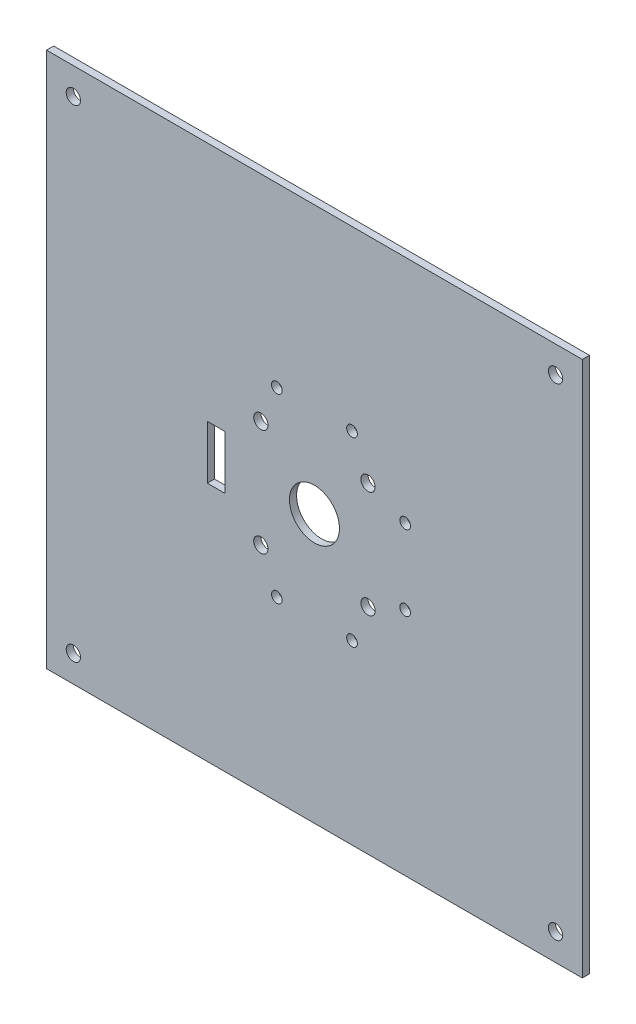
ISO-10303-21;
HEADER;
FILE_DESCRIPTION(('STEP AP214'),'2;1');
FILE_NAME('part.step','',(''),(''),'','','');
FILE_SCHEMA(('AUTOMOTIVE_DESIGN { 1 0 10303 214 1 1 1 1 }'));
ENDSEC;
DATA;
#1=APPLICATION_CONTEXT('core data for automotive mechanical design processes');
#2=APPLICATION_PROTOCOL_DEFINITION('international standard','automotive_design',2000,#1);
#3=PRODUCT_CONTEXT('',#1,'mechanical');
#4=PRODUCT('Part','Part','',(#3));
#5=PRODUCT_RELATED_PRODUCT_CATEGORY('part','',(#4));
#6=PRODUCT_DEFINITION_FORMATION('','',#4);
#7=PRODUCT_DEFINITION_CONTEXT('part definition',#1,'design');
#8=PRODUCT_DEFINITION('design','',#6,#7);
#9=PRODUCT_DEFINITION_SHAPE('','',#8);
#10=(LENGTH_UNIT() NAMED_UNIT(*) SI_UNIT(.MILLI.,.METRE.));
#11=(NAMED_UNIT(*) PLANE_ANGLE_UNIT() SI_UNIT($,.RADIAN.));
#12=(NAMED_UNIT(*) SI_UNIT($,.STERADIAN.) SOLID_ANGLE_UNIT());
#13=UNCERTAINTY_MEASURE_WITH_UNIT(LENGTH_MEASURE(1.E-05),#10,'distance_accuracy_value','');
#14=(GEOMETRIC_REPRESENTATION_CONTEXT(3) GLOBAL_UNCERTAINTY_ASSIGNED_CONTEXT((#13)) GLOBAL_UNIT_ASSIGNED_CONTEXT((#10,
#11,#12)) REPRESENTATION_CONTEXT('',''));
#15=CARTESIAN_POINT('',(0.,0.,0.));
#16=DIRECTION('',(0.,0.,1.));
#17=DIRECTION('',(1.,0.,0.));
#18=AXIS2_PLACEMENT_3D('',#15,#16,#17);
#19=CARTESIAN_POINT('',(75.,-75.,2.));
#20=DIRECTION('',(-1.,0.,0.));
#21=DIRECTION('',(0.,0.,1.));
#22=AXIS2_PLACEMENT_3D('',#19,#20,#21);
#23=PLANE('',#22);
#24=DIRECTION('',(0.,1.,0.));
#25=VECTOR('',#24,1.);
#26=CARTESIAN_POINT('',(75.,-75.,0.));
#27=LINE('',#26,#25);
#28=CARTESIAN_POINT('',(75.,-75.,0.));
#29=VERTEX_POINT('',#28);
#30=CARTESIAN_POINT('',(75.,75.,0.));
#31=VERTEX_POINT('',#30);
#32=EDGE_CURVE('E132',#29,#31,#27,.T.);
#33=ORIENTED_EDGE('',*,*,#32,.T.);
#34=DIRECTION('',(0.,0.,-1.));
#35=VECTOR('',#34,1.);
#36=CARTESIAN_POINT('',(75.,75.,2.));
#37=LINE('',#36,#35);
#38=CARTESIAN_POINT('',(75.,75.,2.));
#39=VERTEX_POINT('',#38);
#40=EDGE_CURVE('E11',#39,#31,#37,.T.);
#41=ORIENTED_EDGE('',*,*,#40,.F.);
#42=DIRECTION('',(0.,1.,0.));
#43=VECTOR('',#42,1.);
#44=CARTESIAN_POINT('',(75.,-75.,2.));
#45=LINE('',#44,#43);
#46=CARTESIAN_POINT('',(75.,-75.,2.));
#47=VERTEX_POINT('',#46);
#48=EDGE_CURVE('E136',#47,#39,#45,.T.);
#49=ORIENTED_EDGE('',*,*,#48,.F.);
#50=DIRECTION('',(0.,0.,-1.));
#51=VECTOR('',#50,1.);
#52=CARTESIAN_POINT('',(75.,-75.,2.));
#53=LINE('',#52,#51);
#54=EDGE_CURVE('E146',#47,#29,#53,.T.);
#55=ORIENTED_EDGE('',*,*,#54,.T.);
#56=EDGE_LOOP('',(#33,#41,#49,#55));
#57=FACE_BOUND('',#56,.T.);
#58=ADVANCED_FACE('F33',(#57),#23,.F.);
#59=CARTESIAN_POINT('',(-75.,75.,2.));
#60=DIRECTION('',(0.,-1.,0.));
#61=DIRECTION('',(0.,0.,-1.));
#62=AXIS2_PLACEMENT_3D('',#59,#60,#61);
#63=PLANE('',#62);
#64=DIRECTION('',(-1.,0.,0.));
#65=VECTOR('',#64,1.);
#66=CARTESIAN_POINT('',(-75.,75.,0.));
#67=LINE('',#66,#65);
#68=CARTESIAN_POINT('',(-75.,75.,0.));
#69=VERTEX_POINT('',#68);
#70=EDGE_CURVE('E149',#31,#69,#67,.T.);
#71=ORIENTED_EDGE('',*,*,#70,.T.);
#72=DIRECTION('',(0.,0.,-1.));
#73=VECTOR('',#72,1.);
#74=CARTESIAN_POINT('',(-75.,75.,2.));
#75=LINE('',#74,#73);
#76=CARTESIAN_POINT('',(-75.,75.,2.));
#77=VERTEX_POINT('',#76);
#78=EDGE_CURVE('E40',#77,#69,#75,.T.);
#79=ORIENTED_EDGE('',*,*,#78,.F.);
#80=DIRECTION('',(-1.,0.,0.));
#81=VECTOR('',#80,1.);
#82=CARTESIAN_POINT('',(-75.,75.,2.));
#83=LINE('',#82,#81);
#84=EDGE_CURVE('E139',#39,#77,#83,.T.);
#85=ORIENTED_EDGE('',*,*,#84,.F.);
#86=ORIENTED_EDGE('',*,*,#40,.T.);
#87=EDGE_LOOP('',(#71,#79,#85,#86));
#88=FACE_BOUND('',#87,.T.);
#89=ADVANCED_FACE('F177',(#88),#63,.F.);
#90=CARTESIAN_POINT('',(-75.,-75.,2.));
#91=DIRECTION('',(1.,0.,0.));
#92=DIRECTION('',(0.,0.,-1.));
#93=AXIS2_PLACEMENT_3D('',#90,#91,#92);
#94=PLANE('',#93);
#95=DIRECTION('',(0.,-1.,0.));
#96=VECTOR('',#95,1.);
#97=CARTESIAN_POINT('',(-75.,-75.,0.));
#98=LINE('',#97,#96);
#99=CARTESIAN_POINT('',(-75.,-75.,0.));
#100=VERTEX_POINT('',#99);
#101=EDGE_CURVE('E151',#69,#100,#98,.T.);
#102=ORIENTED_EDGE('',*,*,#101,.T.);
#103=DIRECTION('',(0.,0.,-1.));
#104=VECTOR('',#103,1.);
#105=CARTESIAN_POINT('',(-75.,-75.,2.));
#106=LINE('',#105,#104);
#107=CARTESIAN_POINT('',(-75.,-75.,2.));
#108=VERTEX_POINT('',#107);
#109=EDGE_CURVE('E156',#108,#100,#106,.T.);
#110=ORIENTED_EDGE('',*,*,#109,.F.);
#111=DIRECTION('',(0.,-1.,0.));
#112=VECTOR('',#111,1.);
#113=CARTESIAN_POINT('',(-75.,-75.,2.));
#114=LINE('',#113,#112);
#115=EDGE_CURVE('E142',#77,#108,#114,.T.);
#116=ORIENTED_EDGE('',*,*,#115,.F.);
#117=ORIENTED_EDGE('',*,*,#78,.T.);
#118=EDGE_LOOP('',(#102,#110,#116,#117));
#119=FACE_BOUND('',#118,.T.);
#120=ADVANCED_FACE('F163',(#119),#94,.F.);
#121=CARTESIAN_POINT('',(-75.,-75.,2.));
#122=DIRECTION('',(0.,1.,0.));
#123=DIRECTION('',(-1.,0.,0.));
#124=AXIS2_PLACEMENT_3D('',#121,#122,#123);
#125=PLANE('',#124);
#126=DIRECTION('',(1.,0.,0.));
#127=VECTOR('',#126,1.);
#128=CARTESIAN_POINT('',(-75.,-75.,0.));
#129=LINE('',#128,#127);
#130=EDGE_CURVE('E140',#100,#29,#129,.T.);
#131=ORIENTED_EDGE('',*,*,#130,.T.);
#132=ORIENTED_EDGE('',*,*,#54,.F.);
#133=DIRECTION('',(1.,0.,0.));
#134=VECTOR('',#133,1.);
#135=CARTESIAN_POINT('',(-75.,-75.,2.));
#136=LINE('',#135,#134);
#137=EDGE_CURVE('E144',#108,#47,#136,.T.);
#138=ORIENTED_EDGE('',*,*,#137,.F.);
#139=ORIENTED_EDGE('',*,*,#109,.T.);
#140=EDGE_LOOP('',(#131,#132,#138,#139));
#141=FACE_BOUND('',#140,.T.);
#142=ADVANCED_FACE('F170',(#141),#125,.F.);
#143=CARTESIAN_POINT('',(0.,0.,2.));
#144=DIRECTION('',(0.,0.,-1.));
#145=DIRECTION('',(-1.,0.,0.));
#146=AXIS2_PLACEMENT_3D('',#143,#144,#145);
#147=PLANE('',#146);
#148=CARTESIAN_POINT('',(67.4999999999995,67.5,2.));
#149=DIRECTION('',(0.,0.,1.));
#150=DIRECTION('',(1.,0.,0.));
#151=AXIS2_PLACEMENT_3D('',#148,#149,#150);
#152=CIRCLE('',#151,2.00000000000001);
#153=CARTESIAN_POINT('',(69.4999999999995,67.5,2.));
#154=VERTEX_POINT('',#153);
#155=EDGE_CURVE('E272',#154,#154,#152,.T.);
#156=ORIENTED_EDGE('',*,*,#155,.F.);
#157=EDGE_LOOP('',(#156));
#158=FACE_BOUND('',#157,.T.);
#159=CARTESIAN_POINT('',(-67.5000000000005,67.5,2.));
#160=DIRECTION('',(0.,0.,1.));
#161=DIRECTION('',(1.,0.,0.));
#162=AXIS2_PLACEMENT_3D('',#159,#160,#161);
#163=CIRCLE('',#162,2.00000000000001);
#164=CARTESIAN_POINT('',(-65.5000000000005,67.5,2.));
#165=VERTEX_POINT('',#164);
#166=EDGE_CURVE('E276',#165,#165,#163,.T.);
#167=ORIENTED_EDGE('',*,*,#166,.F.);
#168=EDGE_LOOP('',(#167));
#169=FACE_BOUND('',#168,.T.);
#170=CARTESIAN_POINT('',(-67.5,-67.5,2.));
#171=DIRECTION('',(0.,0.,1.));
#172=DIRECTION('',(1.,0.,0.));
#173=AXIS2_PLACEMENT_3D('',#170,#171,#172);
#174=CIRCLE('',#173,2.00000000000001);
#175=CARTESIAN_POINT('',(-65.5,-67.5,2.));
#176=VERTEX_POINT('',#175);
#177=EDGE_CURVE('E283',#176,#176,#174,.T.);
#178=ORIENTED_EDGE('',*,*,#177,.F.);
#179=EDGE_LOOP('',(#178));
#180=FACE_BOUND('',#179,.T.);
#181=CARTESIAN_POINT('',(67.5,-67.5,2.));
#182=DIRECTION('',(0.,0.,1.));
#183=DIRECTION('',(1.,0.,0.));
#184=AXIS2_PLACEMENT_3D('',#181,#182,#183);
#185=CIRCLE('',#184,2.00000000000001);
#186=CARTESIAN_POINT('',(69.5,-67.5,2.));
#187=VERTEX_POINT('',#186);
#188=EDGE_CURVE('E289',#187,#187,#185,.T.);
#189=ORIENTED_EDGE('',*,*,#188,.F.);
#190=EDGE_LOOP('',(#189));
#191=FACE_BOUND('',#190,.T.);
#192=CARTESIAN_POINT('',(-10.5237943900402,-25.4066871440603,2.));
#193=DIRECTION('',(0.,0.,1.));
#194=DIRECTION('',(1.,0.,0.));
#195=AXIS2_PLACEMENT_3D('',#192,#193,#194);
#196=CIRCLE('',#195,1.5);
#197=CARTESIAN_POINT('',(-9.02379439004023,-25.4066871440603,2.));
#198=VERTEX_POINT('',#197);
#199=EDGE_CURVE('E295',#198,#198,#196,.T.);
#200=ORIENTED_EDGE('',*,*,#199,.F.);
#201=EDGE_LOOP('',(#200));
#202=FACE_BOUND('',#201,.T.);
#203=CARTESIAN_POINT('',(10.5237943900397,-25.4066871440605,2.));
#204=DIRECTION('',(0.,0.,1.));
#205=DIRECTION('',(1.,0.,0.));
#206=AXIS2_PLACEMENT_3D('',#203,#204,#205);
#207=CIRCLE('',#206,1.5);
#208=CARTESIAN_POINT('',(12.0237943900397,-25.4066871440605,2.));
#209=VERTEX_POINT('',#208);
#210=EDGE_CURVE('E301',#209,#209,#207,.T.);
#211=ORIENTED_EDGE('',*,*,#210,.F.);
#212=EDGE_LOOP('',(#211));
#213=FACE_BOUND('',#212,.T.);
#214=CARTESIAN_POINT('',(25.4066871440603,-10.5237943900402,2.));
#215=DIRECTION('',(0.,0.,1.));
#216=DIRECTION('',(1.,0.,0.));
#217=AXIS2_PLACEMENT_3D('',#214,#215,#216);
#218=CIRCLE('',#217,1.5);
#219=CARTESIAN_POINT('',(26.9066871440603,-10.5237943900402,2.));
#220=VERTEX_POINT('',#219);
#221=EDGE_CURVE('E307',#220,#220,#218,.T.);
#222=ORIENTED_EDGE('',*,*,#221,.F.);
#223=EDGE_LOOP('',(#222));
#224=FACE_BOUND('',#223,.T.);
#225=CARTESIAN_POINT('',(-10.5237943900399,25.4066871440604,2.));
#226=DIRECTION('',(0.,0.,1.));
#227=DIRECTION('',(1.,0.,0.));
#228=AXIS2_PLACEMENT_3D('',#225,#226,#227);
#229=CIRCLE('',#228,1.5);
#230=CARTESIAN_POINT('',(-9.02379439003992,25.4066871440604,2.));
#231=VERTEX_POINT('',#230);
#232=EDGE_CURVE('E313',#231,#231,#229,.T.);
#233=ORIENTED_EDGE('',*,*,#232,.F.);
#234=EDGE_LOOP('',(#233));
#235=FACE_BOUND('',#234,.T.);
#236=CARTESIAN_POINT('',(10.5237943900401,25.4066871440604,2.));
#237=DIRECTION('',(0.,0.,1.));
#238=DIRECTION('',(1.,0.,0.));
#239=AXIS2_PLACEMENT_3D('',#236,#237,#238);
#240=CIRCLE('',#239,1.5);
#241=CARTESIAN_POINT('',(12.0237943900401,25.4066871440604,2.));
#242=VERTEX_POINT('',#241);
#243=EDGE_CURVE('E319',#242,#242,#240,.T.);
#244=ORIENTED_EDGE('',*,*,#243,.F.);
#245=EDGE_LOOP('',(#244));
#246=FACE_BOUND('',#245,.T.);
#247=CARTESIAN_POINT('',(25.4066871440604,10.5237943900398,2.));
#248=DIRECTION('',(0.,0.,1.));
#249=DIRECTION('',(1.,0.,0.));
#250=AXIS2_PLACEMENT_3D('',#247,#248,#249);
#251=CIRCLE('',#250,1.5);
#252=CARTESIAN_POINT('',(26.9066871440604,10.5237943900398,2.));
#253=VERTEX_POINT('',#252);
#254=EDGE_CURVE('E325',#253,#253,#251,.T.);
#255=ORIENTED_EDGE('',*,*,#254,.F.);
#256=EDGE_LOOP('',(#255));
#257=FACE_BOUND('',#256,.T.);
#258=CARTESIAN_POINT('',(-15.,-15.,2.));
#259=DIRECTION('',(0.,0.,1.));
#260=DIRECTION('',(1.,0.,0.));
#261=AXIS2_PLACEMENT_3D('',#258,#259,#260);
#262=CIRCLE('',#261,2.);
#263=CARTESIAN_POINT('',(-13.,-15.,2.));
#264=VERTEX_POINT('',#263);
#265=EDGE_CURVE('E331',#264,#264,#262,.T.);
#266=ORIENTED_EDGE('',*,*,#265,.F.);
#267=EDGE_LOOP('',(#266));
#268=FACE_BOUND('',#267,.T.);
#269=CARTESIAN_POINT('',(15.,-15.,2.));
#270=DIRECTION('',(0.,0.,1.));
#271=DIRECTION('',(1.,0.,0.));
#272=AXIS2_PLACEMENT_3D('',#269,#270,#271);
#273=CIRCLE('',#272,2.);
#274=CARTESIAN_POINT('',(17.,-15.,2.));
#275=VERTEX_POINT('',#274);
#276=EDGE_CURVE('E337',#275,#275,#273,.T.);
#277=ORIENTED_EDGE('',*,*,#276,.F.);
#278=EDGE_LOOP('',(#277));
#279=FACE_BOUND('',#278,.T.);
#280=CARTESIAN_POINT('',(-15.0000000000001,15.,2.));
#281=DIRECTION('',(0.,0.,1.));
#282=DIRECTION('',(1.,0.,0.));
#283=AXIS2_PLACEMENT_3D('',#280,#281,#282);
#284=CIRCLE('',#283,2.);
#285=CARTESIAN_POINT('',(-13.0000000000001,15.,2.));
#286=VERTEX_POINT('',#285);
#287=EDGE_CURVE('E343',#286,#286,#284,.T.);
#288=ORIENTED_EDGE('',*,*,#287,.F.);
#289=EDGE_LOOP('',(#288));
#290=FACE_BOUND('',#289,.T.);
#291=CARTESIAN_POINT('',(14.9999999999999,15.,2.));
#292=DIRECTION('',(0.,0.,1.));
#293=DIRECTION('',(1.,0.,0.));
#294=AXIS2_PLACEMENT_3D('',#291,#292,#293);
#295=CIRCLE('',#294,2.);
#296=CARTESIAN_POINT('',(16.9999999999999,15.,2.));
#297=VERTEX_POINT('',#296);
#298=EDGE_CURVE('E349',#297,#297,#295,.T.);
#299=ORIENTED_EDGE('',*,*,#298,.F.);
#300=EDGE_LOOP('',(#299));
#301=FACE_BOUND('',#300,.T.);
#302=CARTESIAN_POINT('',(0.,0.,2.));
#303=DIRECTION('',(0.,0.,1.));
#304=DIRECTION('',(1.,0.,0.));
#305=AXIS2_PLACEMENT_3D('',#302,#303,#304);
#306=CIRCLE('',#305,7.);
#307=CARTESIAN_POINT('',(7.,0.,2.));
#308=VERTEX_POINT('',#307);
#309=EDGE_CURVE('E126',#308,#308,#306,.T.);
#310=ORIENTED_EDGE('',*,*,#309,.F.);
#311=EDGE_LOOP('',(#310));
#312=FACE_BOUND('',#311,.T.);
#313=DIRECTION('',(0.,1.,0.));
#314=VECTOR('',#313,1.);
#315=CARTESIAN_POINT('',(-25.,-7.50000000000001,2.));
#316=LINE('',#315,#314);
#317=CARTESIAN_POINT('',(-25.,-7.50000000000001,2.));
#318=VERTEX_POINT('',#317);
#319=CARTESIAN_POINT('',(-25.,7.49999999999999,2.));
#320=VERTEX_POINT('',#319);
#321=EDGE_CURVE('E125',#318,#320,#316,.T.);
#322=ORIENTED_EDGE('',*,*,#321,.F.);
#323=DIRECTION('',(1.,0.,0.));
#324=VECTOR('',#323,1.);
#325=CARTESIAN_POINT('',(-30.,-7.50000000000001,2.));
#326=LINE('',#325,#324);
#327=CARTESIAN_POINT('',(-30.,-7.50000000000001,2.));
#328=VERTEX_POINT('',#327);
#329=EDGE_CURVE('E47',#328,#318,#326,.T.);
#330=ORIENTED_EDGE('',*,*,#329,.F.);
#331=DIRECTION('',(0.,1.,0.));
#332=VECTOR('',#331,1.);
#333=CARTESIAN_POINT('',(-30.,-7.50000000000001,2.));
#334=LINE('',#333,#332);
#335=CARTESIAN_POINT('',(-30.,7.49999999999998,2.));
#336=VERTEX_POINT('',#335);
#337=EDGE_CURVE('E113',#328,#336,#334,.T.);
#338=ORIENTED_EDGE('',*,*,#337,.T.);
#339=DIRECTION('',(1.,0.,0.));
#340=VECTOR('',#339,1.);
#341=CARTESIAN_POINT('',(-30.,7.49999999999998,2.));
#342=LINE('',#341,#340);
#343=EDGE_CURVE('E116',#336,#320,#342,.T.);
#344=ORIENTED_EDGE('',*,*,#343,.T.);
#345=EDGE_LOOP('',(#322,#330,#338,#344));
#346=FACE_BOUND('',#345,.T.);
#347=ORIENTED_EDGE('',*,*,#48,.T.);
#348=ORIENTED_EDGE('',*,*,#84,.T.);
#349=ORIENTED_EDGE('',*,*,#115,.T.);
#350=ORIENTED_EDGE('',*,*,#137,.T.);
#351=EDGE_LOOP('',(#347,#348,#349,#350));
#352=FACE_BOUND('',#351,.T.);
#353=ADVANCED_FACE('F176',(#158,#169,#180,#191,#202,#213,#224,#235,#246,#257,#268,#279,#290,
#301,#312,#346,#352),#147,.F.);
#354=CARTESIAN_POINT('',(0.,0.,0.));
#355=DIRECTION('',(0.,0.,-1.));
#356=DIRECTION('',(-1.,0.,0.));
#357=AXIS2_PLACEMENT_3D('',#354,#355,#356);
#358=PLANE('',#357);
#359=CARTESIAN_POINT('',(67.4999999999995,67.5,0.));
#360=DIRECTION('',(0.,0.,1.));
#361=DIRECTION('',(1.,0.,0.));
#362=AXIS2_PLACEMENT_3D('',#359,#360,#361);
#363=CIRCLE('',#362,2.00000000000001);
#364=CARTESIAN_POINT('',(69.4999999999995,67.5,0.));
#365=VERTEX_POINT('',#364);
#366=EDGE_CURVE('E269',#365,#365,#363,.T.);
#367=ORIENTED_EDGE('',*,*,#366,.T.);
#368=EDGE_LOOP('',(#367));
#369=FACE_BOUND('',#368,.T.);
#370=CARTESIAN_POINT('',(-67.5000000000005,67.5,0.));
#371=DIRECTION('',(0.,0.,1.));
#372=DIRECTION('',(1.,0.,0.));
#373=AXIS2_PLACEMENT_3D('',#370,#371,#372);
#374=CIRCLE('',#373,2.00000000000001);
#375=CARTESIAN_POINT('',(-65.5000000000005,67.5,0.));
#376=VERTEX_POINT('',#375);
#377=EDGE_CURVE('E273',#376,#376,#374,.T.);
#378=ORIENTED_EDGE('',*,*,#377,.T.);
#379=EDGE_LOOP('',(#378));
#380=FACE_BOUND('',#379,.T.);
#381=CARTESIAN_POINT('',(-67.5,-67.5,0.));
#382=DIRECTION('',(0.,0.,1.));
#383=DIRECTION('',(1.,0.,0.));
#384=AXIS2_PLACEMENT_3D('',#381,#382,#383);
#385=CIRCLE('',#384,2.00000000000001);
#386=CARTESIAN_POINT('',(-65.5,-67.5,0.));
#387=VERTEX_POINT('',#386);
#388=EDGE_CURVE('E281',#387,#387,#385,.T.);
#389=ORIENTED_EDGE('',*,*,#388,.T.);
#390=EDGE_LOOP('',(#389));
#391=FACE_BOUND('',#390,.T.);
#392=CARTESIAN_POINT('',(67.5,-67.5,0.));
#393=DIRECTION('',(0.,0.,1.));
#394=DIRECTION('',(1.,0.,0.));
#395=AXIS2_PLACEMENT_3D('',#392,#393,#394);
#396=CIRCLE('',#395,2.00000000000001);
#397=CARTESIAN_POINT('',(69.5,-67.5,0.));
#398=VERTEX_POINT('',#397);
#399=EDGE_CURVE('E286',#398,#398,#396,.T.);
#400=ORIENTED_EDGE('',*,*,#399,.T.);
#401=EDGE_LOOP('',(#400));
#402=FACE_BOUND('',#401,.T.);
#403=CARTESIAN_POINT('',(-10.5237943900402,-25.4066871440603,0.));
#404=DIRECTION('',(0.,0.,1.));
#405=DIRECTION('',(1.,0.,0.));
#406=AXIS2_PLACEMENT_3D('',#403,#404,#405);
#407=CIRCLE('',#406,1.5);
#408=CARTESIAN_POINT('',(-9.02379439004023,-25.4066871440603,0.));
#409=VERTEX_POINT('',#408);
#410=EDGE_CURVE('E292',#409,#409,#407,.T.);
#411=ORIENTED_EDGE('',*,*,#410,.T.);
#412=EDGE_LOOP('',(#411));
#413=FACE_BOUND('',#412,.T.);
#414=CARTESIAN_POINT('',(10.5237943900397,-25.4066871440605,0.));
#415=DIRECTION('',(0.,0.,1.));
#416=DIRECTION('',(1.,0.,0.));
#417=AXIS2_PLACEMENT_3D('',#414,#415,#416);
#418=CIRCLE('',#417,1.5);
#419=CARTESIAN_POINT('',(12.0237943900397,-25.4066871440605,0.));
#420=VERTEX_POINT('',#419);
#421=EDGE_CURVE('E298',#420,#420,#418,.T.);
#422=ORIENTED_EDGE('',*,*,#421,.T.);
#423=EDGE_LOOP('',(#422));
#424=FACE_BOUND('',#423,.T.);
#425=CARTESIAN_POINT('',(25.4066871440603,-10.5237943900402,0.));
#426=DIRECTION('',(0.,0.,1.));
#427=DIRECTION('',(1.,0.,0.));
#428=AXIS2_PLACEMENT_3D('',#425,#426,#427);
#429=CIRCLE('',#428,1.5);
#430=CARTESIAN_POINT('',(26.9066871440603,-10.5237943900402,0.));
#431=VERTEX_POINT('',#430);
#432=EDGE_CURVE('E304',#431,#431,#429,.T.);
#433=ORIENTED_EDGE('',*,*,#432,.T.);
#434=EDGE_LOOP('',(#433));
#435=FACE_BOUND('',#434,.T.);
#436=CARTESIAN_POINT('',(-10.5237943900399,25.4066871440604,0.));
#437=DIRECTION('',(0.,0.,1.));
#438=DIRECTION('',(1.,0.,0.));
#439=AXIS2_PLACEMENT_3D('',#436,#437,#438);
#440=CIRCLE('',#439,1.5);
#441=CARTESIAN_POINT('',(-9.02379439003992,25.4066871440604,0.));
#442=VERTEX_POINT('',#441);
#443=EDGE_CURVE('E310',#442,#442,#440,.T.);
#444=ORIENTED_EDGE('',*,*,#443,.T.);
#445=EDGE_LOOP('',(#444));
#446=FACE_BOUND('',#445,.T.);
#447=CARTESIAN_POINT('',(10.5237943900401,25.4066871440604,0.));
#448=DIRECTION('',(0.,0.,1.));
#449=DIRECTION('',(1.,0.,0.));
#450=AXIS2_PLACEMENT_3D('',#447,#448,#449);
#451=CIRCLE('',#450,1.5);
#452=CARTESIAN_POINT('',(12.0237943900401,25.4066871440604,0.));
#453=VERTEX_POINT('',#452);
#454=EDGE_CURVE('E316',#453,#453,#451,.T.);
#455=ORIENTED_EDGE('',*,*,#454,.T.);
#456=EDGE_LOOP('',(#455));
#457=FACE_BOUND('',#456,.T.);
#458=CARTESIAN_POINT('',(25.4066871440604,10.5237943900398,0.));
#459=DIRECTION('',(0.,0.,1.));
#460=DIRECTION('',(1.,0.,0.));
#461=AXIS2_PLACEMENT_3D('',#458,#459,#460);
#462=CIRCLE('',#461,1.5);
#463=CARTESIAN_POINT('',(26.9066871440604,10.5237943900398,0.));
#464=VERTEX_POINT('',#463);
#465=EDGE_CURVE('E322',#464,#464,#462,.T.);
#466=ORIENTED_EDGE('',*,*,#465,.T.);
#467=EDGE_LOOP('',(#466));
#468=FACE_BOUND('',#467,.T.);
#469=CARTESIAN_POINT('',(-15.,-15.,0.));
#470=DIRECTION('',(0.,0.,1.));
#471=DIRECTION('',(1.,0.,0.));
#472=AXIS2_PLACEMENT_3D('',#469,#470,#471);
#473=CIRCLE('',#472,2.);
#474=CARTESIAN_POINT('',(-13.,-15.,0.));
#475=VERTEX_POINT('',#474);
#476=EDGE_CURVE('E328',#475,#475,#473,.T.);
#477=ORIENTED_EDGE('',*,*,#476,.T.);
#478=EDGE_LOOP('',(#477));
#479=FACE_BOUND('',#478,.T.);
#480=CARTESIAN_POINT('',(15.,-15.,0.));
#481=DIRECTION('',(0.,0.,1.));
#482=DIRECTION('',(1.,0.,0.));
#483=AXIS2_PLACEMENT_3D('',#480,#481,#482);
#484=CIRCLE('',#483,2.);
#485=CARTESIAN_POINT('',(17.,-15.,0.));
#486=VERTEX_POINT('',#485);
#487=EDGE_CURVE('E334',#486,#486,#484,.T.);
#488=ORIENTED_EDGE('',*,*,#487,.T.);
#489=EDGE_LOOP('',(#488));
#490=FACE_BOUND('',#489,.T.);
#491=CARTESIAN_POINT('',(-15.0000000000001,15.,0.));
#492=DIRECTION('',(0.,0.,1.));
#493=DIRECTION('',(1.,0.,0.));
#494=AXIS2_PLACEMENT_3D('',#491,#492,#493);
#495=CIRCLE('',#494,2.);
#496=CARTESIAN_POINT('',(-13.0000000000001,15.,0.));
#497=VERTEX_POINT('',#496);
#498=EDGE_CURVE('E340',#497,#497,#495,.T.);
#499=ORIENTED_EDGE('',*,*,#498,.T.);
#500=EDGE_LOOP('',(#499));
#501=FACE_BOUND('',#500,.T.);
#502=CARTESIAN_POINT('',(14.9999999999999,15.,0.));
#503=DIRECTION('',(0.,0.,1.));
#504=DIRECTION('',(1.,0.,0.));
#505=AXIS2_PLACEMENT_3D('',#502,#503,#504);
#506=CIRCLE('',#505,2.);
#507=CARTESIAN_POINT('',(16.9999999999999,15.,0.));
#508=VERTEX_POINT('',#507);
#509=EDGE_CURVE('E346',#508,#508,#506,.T.);
#510=ORIENTED_EDGE('',*,*,#509,.T.);
#511=EDGE_LOOP('',(#510));
#512=FACE_BOUND('',#511,.T.);
#513=CARTESIAN_POINT('',(0.,0.,0.));
#514=DIRECTION('',(0.,0.,1.));
#515=DIRECTION('',(1.,0.,0.));
#516=AXIS2_PLACEMENT_3D('',#513,#514,#515);
#517=CIRCLE('',#516,7.);
#518=CARTESIAN_POINT('',(7.,0.,0.));
#519=VERTEX_POINT('',#518);
#520=EDGE_CURVE('E119',#519,#519,#517,.T.);
#521=ORIENTED_EDGE('',*,*,#520,.T.);
#522=EDGE_LOOP('',(#521));
#523=FACE_BOUND('',#522,.T.);
#524=DIRECTION('',(1.,0.,0.));
#525=VECTOR('',#524,1.);
#526=CARTESIAN_POINT('',(-30.,-7.50000000000001,0.));
#527=LINE('',#526,#525);
#528=CARTESIAN_POINT('',(-30.,-7.50000000000001,0.));
#529=VERTEX_POINT('',#528);
#530=CARTESIAN_POINT('',(-25.,-7.50000000000001,0.));
#531=VERTEX_POINT('',#530);
#532=EDGE_CURVE('E99',#529,#531,#527,.T.);
#533=ORIENTED_EDGE('',*,*,#532,.T.);
#534=DIRECTION('',(0.,1.,0.));
#535=VECTOR('',#534,1.);
#536=CARTESIAN_POINT('',(-25.,-7.50000000000001,0.));
#537=LINE('',#536,#535);
#538=CARTESIAN_POINT('',(-25.,7.49999999999999,0.));
#539=VERTEX_POINT('',#538);
#540=EDGE_CURVE('E105',#531,#539,#537,.T.);
#541=ORIENTED_EDGE('',*,*,#540,.T.);
#542=DIRECTION('',(1.,0.,0.));
#543=VECTOR('',#542,1.);
#544=CARTESIAN_POINT('',(-30.,7.49999999999998,0.));
#545=LINE('',#544,#543);
#546=CARTESIAN_POINT('',(-30.,7.49999999999998,0.));
#547=VERTEX_POINT('',#546);
#548=EDGE_CURVE('E109',#547,#539,#545,.T.);
#549=ORIENTED_EDGE('',*,*,#548,.F.);
#550=DIRECTION('',(0.,1.,0.));
#551=VECTOR('',#550,1.);
#552=CARTESIAN_POINT('',(-30.,-7.50000000000001,0.));
#553=LINE('',#552,#551);
#554=EDGE_CURVE('E102',#529,#547,#553,.T.);
#555=ORIENTED_EDGE('',*,*,#554,.F.);
#556=EDGE_LOOP('',(#533,#541,#549,#555));
#557=FACE_BOUND('',#556,.T.);
#558=ORIENTED_EDGE('',*,*,#32,.F.);
#559=ORIENTED_EDGE('',*,*,#130,.F.);
#560=ORIENTED_EDGE('',*,*,#101,.F.);
#561=ORIENTED_EDGE('',*,*,#70,.F.);
#562=EDGE_LOOP('',(#558,#559,#560,#561));
#563=FACE_BOUND('',#562,.T.);
#564=ADVANCED_FACE('F111',(#369,#380,#391,#402,#413,#424,#435,#446,#457,#468,#479,#490,#501,
#512,#523,#557,#563),#358,.T.);
#565=CARTESIAN_POINT('',(-30.,-7.50000000000001,0.));
#566=DIRECTION('',(0.,-1.,0.));
#567=DIRECTION('',(0.,0.,-1.));
#568=AXIS2_PLACEMENT_3D('',#565,#566,#567);
#569=PLANE('',#568);
#570=ORIENTED_EDGE('',*,*,#329,.T.);
#571=DIRECTION('',(0.,0.,1.));
#572=VECTOR('',#571,1.);
#573=CARTESIAN_POINT('',(-25.,-7.50000000000001,0.));
#574=LINE('',#573,#572);
#575=EDGE_CURVE('E96',#531,#318,#574,.T.);
#576=ORIENTED_EDGE('',*,*,#575,.F.);
#577=ORIENTED_EDGE('',*,*,#532,.F.);
#578=DIRECTION('',(0.,0.,1.));
#579=VECTOR('',#578,1.);
#580=CARTESIAN_POINT('',(-30.,-7.50000000000001,0.));
#581=LINE('',#580,#579);
#582=EDGE_CURVE('E130',#529,#328,#581,.T.);
#583=ORIENTED_EDGE('',*,*,#582,.T.);
#584=EDGE_LOOP('',(#570,#576,#577,#583));
#585=FACE_BOUND('',#584,.T.);
#586=ADVANCED_FACE('F97',(#585),#569,.F.);
#587=CARTESIAN_POINT('',(-30.,-7.50000000000001,0.));
#588=DIRECTION('',(1.,0.,0.));
#589=DIRECTION('',(0.,0.,-1.));
#590=AXIS2_PLACEMENT_3D('',#587,#588,#589);
#591=PLANE('',#590);
#592=ORIENTED_EDGE('',*,*,#337,.F.);
#593=ORIENTED_EDGE('',*,*,#582,.F.);
#594=ORIENTED_EDGE('',*,*,#554,.T.);
#595=DIRECTION('',(0.,0.,1.));
#596=VECTOR('',#595,1.);
#597=CARTESIAN_POINT('',(-30.,7.49999999999998,0.));
#598=LINE('',#597,#596);
#599=EDGE_CURVE('E133',#547,#336,#598,.T.);
#600=ORIENTED_EDGE('',*,*,#599,.T.);
#601=EDGE_LOOP('',(#592,#593,#594,#600));
#602=FACE_BOUND('',#601,.T.);
#603=ADVANCED_FACE('F195',(#602),#591,.T.);
#604=CARTESIAN_POINT('',(-30.,7.49999999999998,0.));
#605=DIRECTION('',(0.,-1.,0.));
#606=DIRECTION('',(1.,0.,0.));
#607=AXIS2_PLACEMENT_3D('',#604,#605,#606);
#608=PLANE('',#607);
#609=ORIENTED_EDGE('',*,*,#343,.F.);
#610=ORIENTED_EDGE('',*,*,#599,.F.);
#611=ORIENTED_EDGE('',*,*,#548,.T.);
#612=DIRECTION('',(0.,0.,1.));
#613=VECTOR('',#612,1.);
#614=CARTESIAN_POINT('',(-25.,7.49999999999999,0.));
#615=LINE('',#614,#613);
#616=EDGE_CURVE('E55',#539,#320,#615,.T.);
#617=ORIENTED_EDGE('',*,*,#616,.T.);
#618=EDGE_LOOP('',(#609,#610,#611,#617));
#619=FACE_BOUND('',#618,.T.);
#620=ADVANCED_FACE('F199',(#619),#608,.T.);
#621=CARTESIAN_POINT('',(-25.,-7.50000000000001,0.));
#622=DIRECTION('',(1.,0.,0.));
#623=DIRECTION('',(0.,0.,-1.));
#624=AXIS2_PLACEMENT_3D('',#621,#622,#623);
#625=PLANE('',#624);
#626=ORIENTED_EDGE('',*,*,#321,.T.);
#627=ORIENTED_EDGE('',*,*,#616,.F.);
#628=ORIENTED_EDGE('',*,*,#540,.F.);
#629=ORIENTED_EDGE('',*,*,#575,.T.);
#630=EDGE_LOOP('',(#626,#627,#628,#629));
#631=FACE_BOUND('',#630,.T.);
#632=ADVANCED_FACE('F106',(#631),#625,.F.);
#633=CARTESIAN_POINT('',(0.,0.,0.));
#634=DIRECTION('',(0.,0.,1.));
#635=DIRECTION('',(1.,0.,0.));
#636=AXIS2_PLACEMENT_3D('',#633,#634,#635);
#637=CYLINDRICAL_SURFACE('',#636,7.);
#638=ORIENTED_EDGE('',*,*,#520,.F.);
#639=EDGE_LOOP('',(#638));
#640=FACE_BOUND('',#639,.T.);
#641=ORIENTED_EDGE('',*,*,#309,.T.);
#642=EDGE_LOOP('',(#641));
#643=FACE_BOUND('',#642,.T.);
#644=ADVANCED_FACE('F198',(#640,#643),#637,.F.);
#645=CARTESIAN_POINT('',(14.9999999999999,15.,0.));
#646=DIRECTION('',(0.,0.,1.));
#647=DIRECTION('',(1.,0.,0.));
#648=AXIS2_PLACEMENT_3D('',#645,#646,#647);
#649=CYLINDRICAL_SURFACE('',#648,2.);
#650=ORIENTED_EDGE('',*,*,#509,.F.);
#651=EDGE_LOOP('',(#650));
#652=FACE_BOUND('',#651,.T.);
#653=ORIENTED_EDGE('',*,*,#298,.T.);
#654=EDGE_LOOP('',(#653));
#655=FACE_BOUND('',#654,.T.);
#656=ADVANCED_FACE('F208',(#652,#655),#649,.F.);
#657=CARTESIAN_POINT('',(-15.0000000000001,15.,0.));
#658=DIRECTION('',(0.,0.,1.));
#659=DIRECTION('',(1.,0.,0.));
#660=AXIS2_PLACEMENT_3D('',#657,#658,#659);
#661=CYLINDRICAL_SURFACE('',#660,2.);
#662=ORIENTED_EDGE('',*,*,#498,.F.);
#663=EDGE_LOOP('',(#662));
#664=FACE_BOUND('',#663,.T.);
#665=ORIENTED_EDGE('',*,*,#287,.T.);
#666=EDGE_LOOP('',(#665));
#667=FACE_BOUND('',#666,.T.);
#668=ADVANCED_FACE('F212',(#664,#667),#661,.F.);
#669=CARTESIAN_POINT('',(15.,-15.,0.));
#670=DIRECTION('',(0.,0.,1.));
#671=DIRECTION('',(1.,0.,0.));
#672=AXIS2_PLACEMENT_3D('',#669,#670,#671);
#673=CYLINDRICAL_SURFACE('',#672,2.);
#674=ORIENTED_EDGE('',*,*,#487,.F.);
#675=EDGE_LOOP('',(#674));
#676=FACE_BOUND('',#675,.T.);
#677=ORIENTED_EDGE('',*,*,#276,.T.);
#678=EDGE_LOOP('',(#677));
#679=FACE_BOUND('',#678,.T.);
#680=ADVANCED_FACE('F216',(#676,#679),#673,.F.);
#681=CARTESIAN_POINT('',(-15.,-15.,0.));
#682=DIRECTION('',(0.,0.,1.));
#683=DIRECTION('',(1.,0.,0.));
#684=AXIS2_PLACEMENT_3D('',#681,#682,#683);
#685=CYLINDRICAL_SURFACE('',#684,2.);
#686=ORIENTED_EDGE('',*,*,#476,.F.);
#687=EDGE_LOOP('',(#686));
#688=FACE_BOUND('',#687,.T.);
#689=ORIENTED_EDGE('',*,*,#265,.T.);
#690=EDGE_LOOP('',(#689));
#691=FACE_BOUND('',#690,.T.);
#692=ADVANCED_FACE('F220',(#688,#691),#685,.F.);
#693=CARTESIAN_POINT('',(25.4066871440604,10.5237943900398,0.));
#694=DIRECTION('',(0.,0.,1.));
#695=DIRECTION('',(1.,0.,0.));
#696=AXIS2_PLACEMENT_3D('',#693,#694,#695);
#697=CYLINDRICAL_SURFACE('',#696,1.5);
#698=ORIENTED_EDGE('',*,*,#465,.F.);
#699=EDGE_LOOP('',(#698));
#700=FACE_BOUND('',#699,.T.);
#701=ORIENTED_EDGE('',*,*,#254,.T.);
#702=EDGE_LOOP('',(#701));
#703=FACE_BOUND('',#702,.T.);
#704=ADVANCED_FACE('F224',(#700,#703),#697,.F.);
#705=CARTESIAN_POINT('',(10.5237943900401,25.4066871440604,0.));
#706=DIRECTION('',(0.,0.,1.));
#707=DIRECTION('',(1.,0.,0.));
#708=AXIS2_PLACEMENT_3D('',#705,#706,#707);
#709=CYLINDRICAL_SURFACE('',#708,1.5);
#710=ORIENTED_EDGE('',*,*,#454,.F.);
#711=EDGE_LOOP('',(#710));
#712=FACE_BOUND('',#711,.T.);
#713=ORIENTED_EDGE('',*,*,#243,.T.);
#714=EDGE_LOOP('',(#713));
#715=FACE_BOUND('',#714,.T.);
#716=ADVANCED_FACE('F228',(#712,#715),#709,.F.);
#717=CARTESIAN_POINT('',(-10.5237943900399,25.4066871440604,0.));
#718=DIRECTION('',(0.,0.,1.));
#719=DIRECTION('',(1.,0.,0.));
#720=AXIS2_PLACEMENT_3D('',#717,#718,#719);
#721=CYLINDRICAL_SURFACE('',#720,1.5);
#722=ORIENTED_EDGE('',*,*,#443,.F.);
#723=EDGE_LOOP('',(#722));
#724=FACE_BOUND('',#723,.T.);
#725=ORIENTED_EDGE('',*,*,#232,.T.);
#726=EDGE_LOOP('',(#725));
#727=FACE_BOUND('',#726,.T.);
#728=ADVANCED_FACE('F232',(#724,#727),#721,.F.);
#729=CARTESIAN_POINT('',(25.4066871440603,-10.5237943900402,0.));
#730=DIRECTION('',(0.,0.,1.));
#731=DIRECTION('',(1.,0.,0.));
#732=AXIS2_PLACEMENT_3D('',#729,#730,#731);
#733=CYLINDRICAL_SURFACE('',#732,1.5);
#734=ORIENTED_EDGE('',*,*,#432,.F.);
#735=EDGE_LOOP('',(#734));
#736=FACE_BOUND('',#735,.T.);
#737=ORIENTED_EDGE('',*,*,#221,.T.);
#738=EDGE_LOOP('',(#737));
#739=FACE_BOUND('',#738,.T.);
#740=ADVANCED_FACE('F236',(#736,#739),#733,.F.);
#741=CARTESIAN_POINT('',(10.5237943900397,-25.4066871440605,0.));
#742=DIRECTION('',(0.,0.,1.));
#743=DIRECTION('',(1.,0.,0.));
#744=AXIS2_PLACEMENT_3D('',#741,#742,#743);
#745=CYLINDRICAL_SURFACE('',#744,1.5);
#746=ORIENTED_EDGE('',*,*,#421,.F.);
#747=EDGE_LOOP('',(#746));
#748=FACE_BOUND('',#747,.T.);
#749=ORIENTED_EDGE('',*,*,#210,.T.);
#750=EDGE_LOOP('',(#749));
#751=FACE_BOUND('',#750,.T.);
#752=ADVANCED_FACE('F240',(#748,#751),#745,.F.);
#753=CARTESIAN_POINT('',(-10.5237943900402,-25.4066871440603,0.));
#754=DIRECTION('',(0.,0.,1.));
#755=DIRECTION('',(1.,0.,0.));
#756=AXIS2_PLACEMENT_3D('',#753,#754,#755);
#757=CYLINDRICAL_SURFACE('',#756,1.5);
#758=ORIENTED_EDGE('',*,*,#410,.F.);
#759=EDGE_LOOP('',(#758));
#760=FACE_BOUND('',#759,.T.);
#761=ORIENTED_EDGE('',*,*,#199,.T.);
#762=EDGE_LOOP('',(#761));
#763=FACE_BOUND('',#762,.T.);
#764=ADVANCED_FACE('F244',(#760,#763),#757,.F.);
#765=CARTESIAN_POINT('',(67.5,-67.5,0.));
#766=DIRECTION('',(0.,0.,1.));
#767=DIRECTION('',(1.,0.,0.));
#768=AXIS2_PLACEMENT_3D('',#765,#766,#767);
#769=CYLINDRICAL_SURFACE('',#768,2.00000000000001);
#770=ORIENTED_EDGE('',*,*,#399,.F.);
#771=EDGE_LOOP('',(#770));
#772=FACE_BOUND('',#771,.T.);
#773=ORIENTED_EDGE('',*,*,#188,.T.);
#774=EDGE_LOOP('',(#773));
#775=FACE_BOUND('',#774,.T.);
#776=ADVANCED_FACE('F248',(#772,#775),#769,.F.);
#777=CARTESIAN_POINT('',(-67.5,-67.5,0.));
#778=DIRECTION('',(0.,0.,1.));
#779=DIRECTION('',(1.,0.,0.));
#780=AXIS2_PLACEMENT_3D('',#777,#778,#779);
#781=CYLINDRICAL_SURFACE('',#780,2.00000000000001);
#782=ORIENTED_EDGE('',*,*,#388,.F.);
#783=EDGE_LOOP('',(#782));
#784=FACE_BOUND('',#783,.T.);
#785=ORIENTED_EDGE('',*,*,#177,.T.);
#786=EDGE_LOOP('',(#785));
#787=FACE_BOUND('',#786,.T.);
#788=ADVANCED_FACE('F252',(#784,#787),#781,.F.);
#789=CARTESIAN_POINT('',(-67.5000000000005,67.5,0.));
#790=DIRECTION('',(0.,0.,1.));
#791=DIRECTION('',(1.,0.,0.));
#792=AXIS2_PLACEMENT_3D('',#789,#790,#791);
#793=CYLINDRICAL_SURFACE('',#792,2.00000000000001);
#794=ORIENTED_EDGE('',*,*,#377,.F.);
#795=EDGE_LOOP('',(#794));
#796=FACE_BOUND('',#795,.T.);
#797=ORIENTED_EDGE('',*,*,#166,.T.);
#798=EDGE_LOOP('',(#797));
#799=FACE_BOUND('',#798,.T.);
#800=ADVANCED_FACE('F256',(#796,#799),#793,.F.);
#801=CARTESIAN_POINT('',(67.4999999999995,67.5,0.));
#802=DIRECTION('',(0.,0.,1.));
#803=DIRECTION('',(1.,0.,0.));
#804=AXIS2_PLACEMENT_3D('',#801,#802,#803);
#805=CYLINDRICAL_SURFACE('',#804,2.00000000000001);
#806=ORIENTED_EDGE('',*,*,#366,.F.);
#807=EDGE_LOOP('',(#806));
#808=FACE_BOUND('',#807,.T.);
#809=ORIENTED_EDGE('',*,*,#155,.T.);
#810=EDGE_LOOP('',(#809));
#811=FACE_BOUND('',#810,.T.);
#812=ADVANCED_FACE('F260',(#808,#811),#805,.F.);
#813=CLOSED_SHELL('',(#58,#89,#120,#142,#353,#564,#586,#603,#620,#632,#644,#656,#668,#680,#692,
#704,#716,#728,#740,#752,#764,#776,#788,#800,#812));
#814=MANIFOLD_SOLID_BREP('B2',#813);
#815=ADVANCED_BREP_SHAPE_REPRESENTATION('',(#18,#814),#14);
#816=SHAPE_DEFINITION_REPRESENTATION(#9,#815);
ENDSEC;
END-ISO-10303-21;
